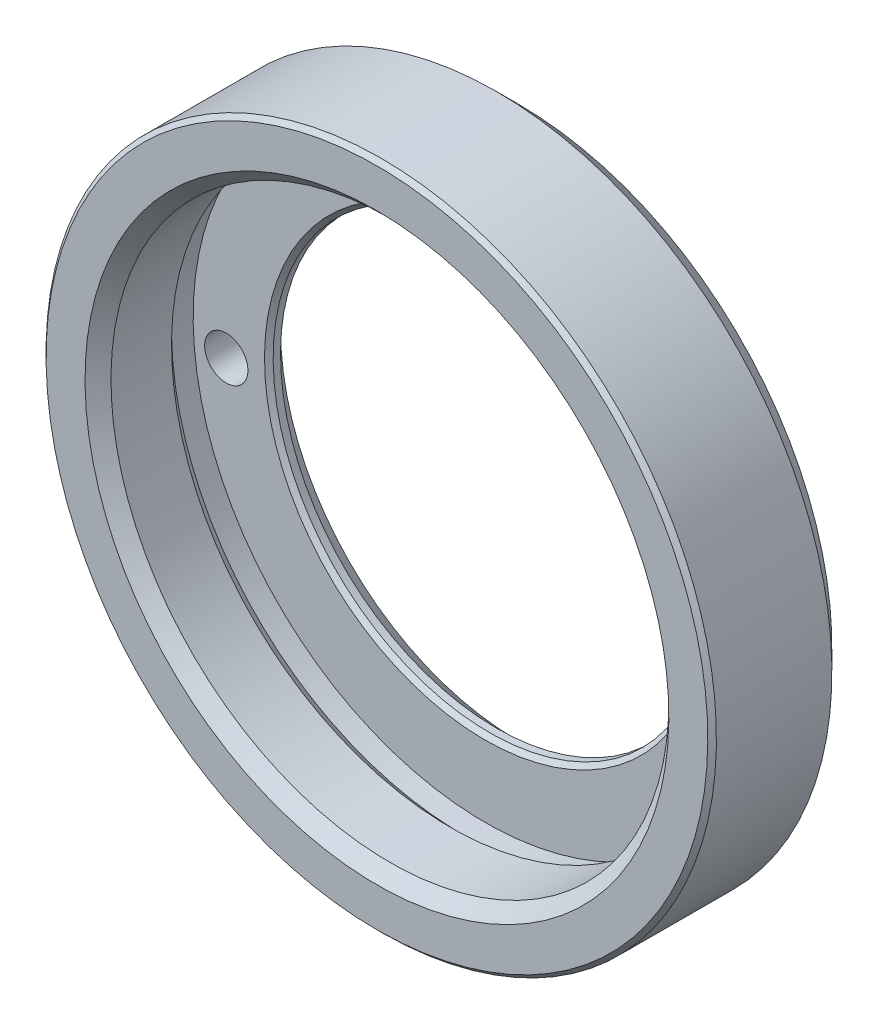
ISO-10303-21;
HEADER;
FILE_DESCRIPTION(('STEP AP214'),'2;1');
FILE_NAME('part.step','',(''),(''),'','','');
FILE_SCHEMA(('AUTOMOTIVE_DESIGN { 1 0 10303 214 1 1 1 1 }'));
ENDSEC;
DATA;
#1=APPLICATION_CONTEXT('core data for automotive mechanical design processes');
#2=APPLICATION_PROTOCOL_DEFINITION('international standard','automotive_design',2000,#1);
#3=PRODUCT_CONTEXT('',#1,'mechanical');
#4=PRODUCT('Part','Part','',(#3));
#5=PRODUCT_RELATED_PRODUCT_CATEGORY('part','',(#4));
#6=PRODUCT_DEFINITION_FORMATION('','',#4);
#7=PRODUCT_DEFINITION_CONTEXT('part definition',#1,'design');
#8=PRODUCT_DEFINITION('design','',#6,#7);
#9=PRODUCT_DEFINITION_SHAPE('','',#8);
#10=(LENGTH_UNIT() NAMED_UNIT(*) SI_UNIT(.MILLI.,.METRE.));
#11=(NAMED_UNIT(*) PLANE_ANGLE_UNIT() SI_UNIT($,.RADIAN.));
#12=(NAMED_UNIT(*) SI_UNIT($,.STERADIAN.) SOLID_ANGLE_UNIT());
#13=UNCERTAINTY_MEASURE_WITH_UNIT(LENGTH_MEASURE(1.E-05),#10,'distance_accuracy_value','');
#14=(GEOMETRIC_REPRESENTATION_CONTEXT(3) GLOBAL_UNCERTAINTY_ASSIGNED_CONTEXT((#13)) GLOBAL_UNIT_ASSIGNED_CONTEXT((#10,
#11,#12)) REPRESENTATION_CONTEXT('',''));
#15=CARTESIAN_POINT('',(0.,0.,0.));
#16=DIRECTION('',(0.,0.,1.));
#17=DIRECTION('',(1.,0.,0.));
#18=AXIS2_PLACEMENT_3D('',#15,#16,#17);
#19=CARTESIAN_POINT('',(0.,0.,-9.23));
#20=DIRECTION('',(0.,0.,1.));
#21=DIRECTION('',(-0.0736701481421577,0.997282662675288,0.));
#22=AXIS2_PLACEMENT_3D('',#19,#20,#21);
#23=PLANE('',#22);
#24=CARTESIAN_POINT('',(0.,0.,-9.23));
#25=DIRECTION('',(0.,0.,1.));
#26=DIRECTION('',(-0.0736701481421577,0.997282662675288,0.));
#27=AXIS2_PLACEMENT_3D('',#24,#25,#26);
#28=CIRCLE('',#27,6.75);
#29=CARTESIAN_POINT('',(-0.497273499959565,6.7316579730582,-9.23));
#30=VERTEX_POINT('',#29);
#31=EDGE_CURVE('E111',#30,#30,#28,.T.);
#32=ORIENTED_EDGE('',*,*,#31,.F.);
#33=EDGE_LOOP('',(#32));
#34=FACE_BOUND('',#33,.T.);
#35=CARTESIAN_POINT('',(0.,0.,-9.23));
#36=DIRECTION('',(0.,0.,1.));
#37=DIRECTION('',(-0.0736701481421577,0.997282662675288,0.));
#38=AXIS2_PLACEMENT_3D('',#35,#36,#37);
#39=CIRCLE('',#38,7.65);
#40=CARTESIAN_POINT('',(0.563576633287506,-7.62921236946595,-9.23));
#41=VERTEX_POINT('',#40);
#42=EDGE_CURVE('E115',#41,#41,#39,.T.);
#43=ORIENTED_EDGE('',*,*,#42,.T.);
#44=EDGE_LOOP('',(#43));
#45=FACE_BOUND('',#44,.T.);
#46=ADVANCED_FACE('F16',(#34,#45),#23,.T.);
#47=CARTESIAN_POINT('',(0.,0.,-12.5));
#48=DIRECTION('',(0.,0.,-1.));
#49=DIRECTION('',(0.997282662675288,0.0736701481421577,0.));
#50=AXIS2_PLACEMENT_3D('',#47,#48,#49);
#51=PLANE('',#50);
#52=CARTESIAN_POINT('',(0.,0.,-12.5));
#53=DIRECTION('',(0.,0.,1.));
#54=DIRECTION('',(0.0736701481421577,-0.997282662675288,0.));
#55=AXIS2_PLACEMENT_3D('',#52,#53,#54);
#56=CIRCLE('',#55,5.5);
#57=CARTESIAN_POINT('',(-5.48505464471409,-0.405185814781868,-12.5));
#58=VERTEX_POINT('',#57);
#59=CARTESIAN_POINT('',(5.48505464471409,0.405185814781868,-12.5));
#60=VERTEX_POINT('',#59);
#61=EDGE_CURVE('E126',#58,#60,#56,.T.);
#62=ORIENTED_EDGE('',*,*,#61,.T.);
#63=CARTESIAN_POINT('',(5.98369597605173,0.442020888852946,-12.5));
#64=DIRECTION('',(0.,0.,-1.));
#65=DIRECTION('',(0.0736701481421577,-0.997282662675288,0.));
#66=AXIS2_PLACEMENT_3D('',#63,#64,#65);
#67=CIRCLE('',#66,0.5);
#68=EDGE_CURVE('E99',#60,#60,#67,.T.);
#69=ORIENTED_EDGE('',*,*,#68,.F.);
#70=CARTESIAN_POINT('',(0.,0.,-12.5));
#71=DIRECTION('',(0.,0.,1.));
#72=DIRECTION('',(0.0736701481421577,-0.997282662675288,0.));
#73=AXIS2_PLACEMENT_3D('',#70,#71,#72);
#74=CIRCLE('',#73,5.5);
#75=EDGE_CURVE('E85',#60,#58,#74,.T.);
#76=ORIENTED_EDGE('',*,*,#75,.T.);
#77=CARTESIAN_POINT('',(-5.98369597605173,-0.442020888852946,-12.5));
#78=DIRECTION('',(0.,0.,-1.));
#79=DIRECTION('',(0.0736701481421577,-0.997282662675288,0.));
#80=AXIS2_PLACEMENT_3D('',#77,#78,#79);
#81=CIRCLE('',#80,0.5);
#82=EDGE_CURVE('E112',#58,#58,#81,.T.);
#83=ORIENTED_EDGE('',*,*,#82,.F.);
#84=EDGE_LOOP('',(#62,#69,#76,#83));
#85=FACE_BOUND('',#84,.T.);
#86=CARTESIAN_POINT('',(0.,0.,-12.5));
#87=DIRECTION('',(0.,0.,-1.));
#88=DIRECTION('',(0.0736701481421577,-0.997282662675288,0.));
#89=AXIS2_PLACEMENT_3D('',#86,#87,#88);
#90=CIRCLE('',#89,7.25);
#91=CARTESIAN_POINT('',(-0.534108574030644,7.23029930439584,-12.5));
#92=VERTEX_POINT('',#91);
#93=EDGE_CURVE('E125',#92,#92,#90,.T.);
#94=ORIENTED_EDGE('',*,*,#93,.T.);
#95=EDGE_LOOP('',(#94));
#96=FACE_BOUND('',#95,.T.);
#97=ADVANCED_FACE('F187',(#85,#96),#51,.T.);
#98=CARTESIAN_POINT('',(0.,0.,-11.73));
#99=DIRECTION('',(0.,0.,1.));
#100=DIRECTION('',(-0.0736701481421577,0.997282662675288,0.));
#101=AXIS2_PLACEMENT_3D('',#98,#99,#100);
#102=PLANE('',#101);
#103=CARTESIAN_POINT('',(0.,0.,-11.73));
#104=DIRECTION('',(0.,0.,-1.));
#105=DIRECTION('',(-0.0736701481421578,0.997282662675288,0.));
#106=AXIS2_PLACEMENT_3D('',#103,#104,#105);
#107=CIRCLE('',#106,5.1);
#108=CARTESIAN_POINT('',(-0.375717755525005,5.08614157964397,-11.73));
#109=VERTEX_POINT('',#108);
#110=EDGE_CURVE('E119',#109,#109,#107,.T.);
#111=ORIENTED_EDGE('',*,*,#110,.T.);
#112=EDGE_LOOP('',(#111));
#113=FACE_BOUND('',#112,.T.);
#114=CARTESIAN_POINT('',(-5.98369597605173,-0.442020888852946,-11.73));
#115=DIRECTION('',(0.,0.,-1.));
#116=DIRECTION('',(-0.0736701481421577,0.997282662675288,0.));
#117=AXIS2_PLACEMENT_3D('',#114,#115,#116);
#118=CIRCLE('',#117,0.5);
#119=CARTESIAN_POINT('',(-5.94686090198065,-0.940662220190591,-11.73));
#120=VERTEX_POINT('',#119);
#121=EDGE_CURVE('E107',#120,#120,#118,.T.);
#122=ORIENTED_EDGE('',*,*,#121,.T.);
#123=EDGE_LOOP('',(#122));
#124=FACE_BOUND('',#123,.T.);
#125=CARTESIAN_POINT('',(5.98369597605173,0.442020888852946,-11.73));
#126=DIRECTION('',(0.,0.,-1.));
#127=DIRECTION('',(-0.0736701481421577,0.997282662675288,0.));
#128=AXIS2_PLACEMENT_3D('',#125,#126,#127);
#129=CIRCLE('',#128,0.5);
#130=CARTESIAN_POINT('',(6.02053105012281,-0.056620442484698,-11.73));
#131=VERTEX_POINT('',#130);
#132=EDGE_CURVE('E94',#131,#131,#129,.T.);
#133=ORIENTED_EDGE('',*,*,#132,.T.);
#134=EDGE_LOOP('',(#133));
#135=FACE_BOUND('',#134,.T.);
#136=CARTESIAN_POINT('',(0.,0.,-11.73));
#137=DIRECTION('',(0.,0.,1.));
#138=DIRECTION('',(-0.0736701481421577,0.997282662675288,0.));
#139=AXIS2_PLACEMENT_3D('',#136,#137,#138);
#140=CIRCLE('',#139,6.75);
#141=CARTESIAN_POINT('',(-0.497273499959565,6.7316579730582,-11.73));
#142=VERTEX_POINT('',#141);
#143=EDGE_CURVE('E132',#142,#142,#140,.T.);
#144=ORIENTED_EDGE('',*,*,#143,.T.);
#145=EDGE_LOOP('',(#144));
#146=FACE_BOUND('',#145,.T.);
#147=ADVANCED_FACE('F95',(#113,#124,#135,#146),#102,.T.);
#148=CARTESIAN_POINT('',(0.,0.,-9.592278978389));
#149=DIRECTION('',(0.,0.,1.));
#150=DIRECTION('',(-0.0736701481421578,0.997282662675288,0.));
#151=AXIS2_PLACEMENT_3D('',#148,#149,#150);
#152=CYLINDRICAL_SURFACE('',#151,6.45);
#153=CARTESIAN_POINT('',(0.,0.,-9.53));
#154=DIRECTION('',(0.,0.,1.));
#155=DIRECTION('',(-0.0736701481421578,0.997282662675288,0.));
#156=AXIS2_PLACEMENT_3D('',#153,#154,#155);
#157=CIRCLE('',#156,6.45);
#158=CARTESIAN_POINT('',(-0.475172455516917,6.43247317425561,-9.53));
#159=VERTEX_POINT('',#158);
#160=EDGE_CURVE('E129',#159,#159,#157,.T.);
#161=ORIENTED_EDGE('',*,*,#160,.T.);
#162=EDGE_LOOP('',(#161));
#163=FACE_BOUND('',#162,.T.);
#164=CARTESIAN_POINT('',(0.,0.,-10.93));
#165=DIRECTION('',(0.,0.,1.));
#166=DIRECTION('',(-0.0736701481421578,0.997282662675288,0.));
#167=AXIS2_PLACEMENT_3D('',#164,#165,#166);
#168=CIRCLE('',#167,6.45);
#169=CARTESIAN_POINT('',(-0.475172455516917,6.43247317425561,-10.93));
#170=VERTEX_POINT('',#169);
#171=EDGE_CURVE('E11',#170,#170,#168,.T.);
#172=ORIENTED_EDGE('',*,*,#171,.F.);
#173=EDGE_LOOP('',(#172));
#174=FACE_BOUND('',#173,.T.);
#175=ADVANCED_FACE('F205',(#163,#174),#152,.F.);
#176=CARTESIAN_POINT('',(0.,0.,-10.93));
#177=DIRECTION('',(0.,0.,-1.));
#178=DIRECTION('',(0.0736701481421578,-0.997282662675288,0.));
#179=AXIS2_PLACEMENT_3D('',#176,#177,#178);
#180=CONICAL_SURFACE('',#179,6.45,0.785398163397441);
#181=CARTESIAN_POINT('',(0.,0.,-11.23));
#182=DIRECTION('',(0.,0.,1.));
#183=DIRECTION('',(-0.0736701481421577,0.997282662675288,0.));
#184=AXIS2_PLACEMENT_3D('',#181,#182,#183);
#185=CIRCLE('',#184,6.75);
#186=CARTESIAN_POINT('',(-0.497273499959566,6.7316579730582,-11.23));
#187=VERTEX_POINT('',#186);
#188=EDGE_CURVE('E27',#187,#187,#185,.T.);
#189=ORIENTED_EDGE('',*,*,#188,.F.);
#190=EDGE_LOOP('',(#189));
#191=FACE_BOUND('',#190,.T.);
#192=ORIENTED_EDGE('',*,*,#171,.T.);
#193=EDGE_LOOP('',(#192));
#194=FACE_BOUND('',#193,.T.);
#195=ADVANCED_FACE('F198',(#191,#194),#180,.F.);
#196=CARTESIAN_POINT('',(0.,0.,-9.592278978389));
#197=DIRECTION('',(0.,0.,1.));
#198=DIRECTION('',(-0.0736701481421577,0.997282662675288,0.));
#199=AXIS2_PLACEMENT_3D('',#196,#197,#198);
#200=CYLINDRICAL_SURFACE('',#199,6.75);
#201=ORIENTED_EDGE('',*,*,#188,.T.);
#202=EDGE_LOOP('',(#201));
#203=FACE_BOUND('',#202,.T.);
#204=ORIENTED_EDGE('',*,*,#143,.F.);
#205=EDGE_LOOP('',(#204));
#206=FACE_BOUND('',#205,.T.);
#207=ADVANCED_FACE('F196',(#203,#206),#200,.F.);
#208=CARTESIAN_POINT('',(0.,0.,-9.592278978389));
#209=DIRECTION('',(0.,0.,1.));
#210=DIRECTION('',(-0.0736701481421577,0.997282662675288,0.));
#211=AXIS2_PLACEMENT_3D('',#208,#209,#210);
#212=CYLINDRICAL_SURFACE('',#211,5.);
#213=CARTESIAN_POINT('',(0.,0.,-11.83));
#214=DIRECTION('',(0.,0.,1.));
#215=DIRECTION('',(-0.0736701481421577,0.997282662675288,0.));
#216=AXIS2_PLACEMENT_3D('',#213,#214,#215);
#217=CIRCLE('',#216,5.);
#218=CARTESIAN_POINT('',(-0.368350740710789,4.98641331337644,-11.83));
#219=VERTEX_POINT('',#218);
#220=EDGE_CURVE('E20',#219,#219,#217,.T.);
#221=ORIENTED_EDGE('',*,*,#220,.T.);
#222=EDGE_LOOP('',(#221));
#223=FACE_BOUND('',#222,.T.);
#224=CARTESIAN_POINT('',(0.,0.,-12.));
#225=DIRECTION('',(0.,0.,-1.));
#226=DIRECTION('',(0.0736701481421577,-0.997282662675288,0.));
#227=AXIS2_PLACEMENT_3D('',#224,#225,#226);
#228=CIRCLE('',#227,5.);
#229=CARTESIAN_POINT('',(0.368350740710788,-4.98641331337644,-12.));
#230=VERTEX_POINT('',#229);
#231=EDGE_CURVE('E124',#230,#230,#228,.T.);
#232=ORIENTED_EDGE('',*,*,#231,.T.);
#233=EDGE_LOOP('',(#232));
#234=FACE_BOUND('',#233,.T.);
#235=ADVANCED_FACE('F166',(#223,#234),#212,.F.);
#236=CARTESIAN_POINT('',(0.,0.,-9.592278978389));
#237=DIRECTION('',(0.,0.,1.));
#238=DIRECTION('',(-0.0736701481421578,0.997282662675288,0.));
#239=AXIS2_PLACEMENT_3D('',#236,#237,#238);
#240=CYLINDRICAL_SURFACE('',#239,7.75);
#241=CARTESIAN_POINT('',(0.,0.,-9.33));
#242=DIRECTION('',(0.,0.,-1.));
#243=DIRECTION('',(-0.0736701481421578,0.997282662675288,0.));
#244=AXIS2_PLACEMENT_3D('',#241,#242,#243);
#245=CIRCLE('',#244,7.75);
#246=CARTESIAN_POINT('',(0.570943648101722,-7.72894063573348,-9.33));
#247=VERTEX_POINT('',#246);
#248=EDGE_CURVE('E118',#247,#247,#245,.T.);
#249=ORIENTED_EDGE('',*,*,#248,.T.);
#250=EDGE_LOOP('',(#249));
#251=FACE_BOUND('',#250,.T.);
#252=CARTESIAN_POINT('',(0.,0.,-12.));
#253=DIRECTION('',(0.,0.,1.));
#254=DIRECTION('',(0.0736701481421578,-0.997282662675288,0.));
#255=AXIS2_PLACEMENT_3D('',#252,#253,#254);
#256=CIRCLE('',#255,7.75);
#257=CARTESIAN_POINT('',(-0.570943648101723,7.72894063573348,-12.));
#258=VERTEX_POINT('',#257);
#259=EDGE_CURVE('E121',#258,#258,#256,.T.);
#260=ORIENTED_EDGE('',*,*,#259,.T.);
#261=EDGE_LOOP('',(#260));
#262=FACE_BOUND('',#261,.T.);
#263=ADVANCED_FACE('F203',(#251,#262),#240,.T.);
#264=CARTESIAN_POINT('',(0.,0.,-9.23));
#265=DIRECTION('',(0.,0.,1.));
#266=DIRECTION('',(-0.0736701481421577,0.997282662675288,0.));
#267=AXIS2_PLACEMENT_3D('',#264,#265,#266);
#268=CONICAL_SURFACE('',#267,6.75,0.785398163397442);
#269=ORIENTED_EDGE('',*,*,#31,.T.);
#270=EDGE_LOOP('',(#269));
#271=FACE_BOUND('',#270,.T.);
#272=ORIENTED_EDGE('',*,*,#160,.F.);
#273=EDGE_LOOP('',(#272));
#274=FACE_BOUND('',#273,.T.);
#275=ADVANCED_FACE('F342',(#271,#274),#268,.F.);
#276=CARTESIAN_POINT('',(0.,0.,-12.5));
#277=DIRECTION('',(0.,0.,-1.));
#278=DIRECTION('',(0.0736701481421577,-0.997282662675288,0.));
#279=AXIS2_PLACEMENT_3D('',#276,#277,#278);
#280=CONICAL_SURFACE('',#279,5.5,0.785398163397446);
#281=ORIENTED_EDGE('',*,*,#61,.F.);
#282=ORIENTED_EDGE('',*,*,#75,.F.);
#283=EDGE_LOOP('',(#281,#282));
#284=FACE_BOUND('',#283,.T.);
#285=ORIENTED_EDGE('',*,*,#231,.F.);
#286=EDGE_LOOP('',(#285));
#287=FACE_BOUND('',#286,.T.);
#288=ADVANCED_FACE('F318',(#284,#287),#280,.F.);
#289=CARTESIAN_POINT('',(0.,0.,-12.));
#290=DIRECTION('',(0.,0.,1.));
#291=DIRECTION('',(-0.0736701481421578,0.997282662675288,0.));
#292=AXIS2_PLACEMENT_3D('',#289,#290,#291);
#293=CONICAL_SURFACE('',#292,7.75,0.785398163397448);
#294=ORIENTED_EDGE('',*,*,#259,.F.);
#295=EDGE_LOOP('',(#294));
#296=FACE_BOUND('',#295,.T.);
#297=ORIENTED_EDGE('',*,*,#93,.F.);
#298=EDGE_LOOP('',(#297));
#299=FACE_BOUND('',#298,.T.);
#300=ADVANCED_FACE('F181',(#296,#299),#293,.T.);
#301=CARTESIAN_POINT('',(0.,0.,-9.23));
#302=DIRECTION('',(0.,0.,-1.));
#303=DIRECTION('',(0.0736701481421577,-0.997282662675288,0.));
#304=AXIS2_PLACEMENT_3D('',#301,#302,#303);
#305=CONICAL_SURFACE('',#304,7.65,0.785398163397443);
#306=ORIENTED_EDGE('',*,*,#248,.F.);
#307=EDGE_LOOP('',(#306));
#308=FACE_BOUND('',#307,.T.);
#309=ORIENTED_EDGE('',*,*,#42,.F.);
#310=EDGE_LOOP('',(#309));
#311=FACE_BOUND('',#310,.T.);
#312=ADVANCED_FACE('F171',(#308,#311),#305,.T.);
#313=CARTESIAN_POINT('',(0.,0.,-11.83));
#314=DIRECTION('',(0.,0.,1.));
#315=DIRECTION('',(-0.0736701481421577,0.997282662675288,0.));
#316=AXIS2_PLACEMENT_3D('',#313,#314,#315);
#317=CONICAL_SURFACE('',#316,5.,0.78539816339744);
#318=ORIENTED_EDGE('',*,*,#110,.F.);
#319=EDGE_LOOP('',(#318));
#320=FACE_BOUND('',#319,.T.);
#321=ORIENTED_EDGE('',*,*,#220,.F.);
#322=EDGE_LOOP('',(#321));
#323=FACE_BOUND('',#322,.T.);
#324=ADVANCED_FACE('F169',(#320,#323),#317,.F.);
#325=CARTESIAN_POINT('',(-5.98369597605173,-0.442020888852946,-10.3157864376269));
#326=DIRECTION('',(0.,0.,-1.));
#327=DIRECTION('',(0.0736701481421577,-0.997282662675288,0.));
#328=AXIS2_PLACEMENT_3D('',#325,#326,#327);
#329=CYLINDRICAL_SURFACE('',#328,0.5);
#330=ORIENTED_EDGE('',*,*,#82,.T.);
#331=EDGE_LOOP('',(#330));
#332=FACE_BOUND('',#331,.T.);
#333=ORIENTED_EDGE('',*,*,#121,.F.);
#334=EDGE_LOOP('',(#333));
#335=FACE_BOUND('',#334,.T.);
#336=ADVANCED_FACE('F18',(#332,#335),#329,.F.);
#337=CARTESIAN_POINT('',(5.98369597605173,0.442020888852946,-10.3157864376269));
#338=DIRECTION('',(0.,0.,-1.));
#339=DIRECTION('',(0.0736701481421577,-0.997282662675288,0.));
#340=AXIS2_PLACEMENT_3D('',#337,#338,#339);
#341=CYLINDRICAL_SURFACE('',#340,0.5);
#342=ORIENTED_EDGE('',*,*,#68,.T.);
#343=EDGE_LOOP('',(#342));
#344=FACE_BOUND('',#343,.T.);
#345=ORIENTED_EDGE('',*,*,#132,.F.);
#346=EDGE_LOOP('',(#345));
#347=FACE_BOUND('',#346,.T.);
#348=ADVANCED_FACE('F179',(#344,#347),#341,.F.);
#349=CLOSED_SHELL('',(#46,#97,#147,#175,#195,#207,#235,#263,#275,#288,#300,#312,#324,#336,#348));
#350=MANIFOLD_SOLID_BREP('B1',#349);
#351=ADVANCED_BREP_SHAPE_REPRESENTATION('',(#18,#350),#14);
#352=SHAPE_DEFINITION_REPRESENTATION(#9,#351);
ENDSEC;
END-ISO-10303-21;
